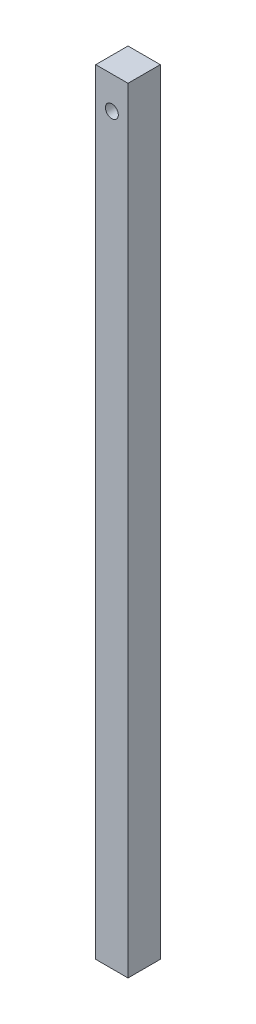
ISO-10303-21;
HEADER;
FILE_DESCRIPTION(('STEP AP214'),'2;1');
FILE_NAME('part.step','',(''),(''),'','','');
FILE_SCHEMA(('AUTOMOTIVE_DESIGN { 1 0 10303 214 1 1 1 1 }'));
ENDSEC;
DATA;
#1=APPLICATION_CONTEXT('core data for automotive mechanical design processes');
#2=APPLICATION_PROTOCOL_DEFINITION('international standard','automotive_design',2000,#1);
#3=PRODUCT_CONTEXT('',#1,'mechanical');
#4=PRODUCT('Part','Part','',(#3));
#5=PRODUCT_RELATED_PRODUCT_CATEGORY('part','',(#4));
#6=PRODUCT_DEFINITION_FORMATION('','',#4);
#7=PRODUCT_DEFINITION_CONTEXT('part definition',#1,'design');
#8=PRODUCT_DEFINITION('design','',#6,#7);
#9=PRODUCT_DEFINITION_SHAPE('','',#8);
#10=(LENGTH_UNIT() NAMED_UNIT(*) SI_UNIT(.MILLI.,.METRE.));
#11=(NAMED_UNIT(*) PLANE_ANGLE_UNIT() SI_UNIT($,.RADIAN.));
#12=(NAMED_UNIT(*) SI_UNIT($,.STERADIAN.) SOLID_ANGLE_UNIT());
#13=UNCERTAINTY_MEASURE_WITH_UNIT(LENGTH_MEASURE(1.E-05),#10,'distance_accuracy_value','');
#14=(GEOMETRIC_REPRESENTATION_CONTEXT(3) GLOBAL_UNCERTAINTY_ASSIGNED_CONTEXT((#13)) GLOBAL_UNIT_ASSIGNED_CONTEXT((#10,
#11,#12)) REPRESENTATION_CONTEXT('',''));
#15=CARTESIAN_POINT('',(0.,0.,0.));
#16=DIRECTION('',(0.,0.,1.));
#17=DIRECTION('',(1.,0.,0.));
#18=AXIS2_PLACEMENT_3D('',#15,#16,#17);
#19=CARTESIAN_POINT('',(-2.5,120.,5.));
#20=DIRECTION('',(1.,0.,0.));
#21=DIRECTION('',(0.,0.,-1.));
#22=AXIS2_PLACEMENT_3D('',#19,#20,#21);
#23=PLANE('',#22);
#24=DIRECTION('',(0.,-1.,0.));
#25=VECTOR('',#24,1.);
#26=CARTESIAN_POINT('',(-2.5,120.,0.));
#27=LINE('',#26,#25);
#28=CARTESIAN_POINT('',(-2.5,120.,0.));
#29=VERTEX_POINT('',#28);
#30=CARTESIAN_POINT('',(-2.5,0.,0.));
#31=VERTEX_POINT('',#30);
#32=EDGE_CURVE('E102',#29,#31,#27,.T.);
#33=ORIENTED_EDGE('',*,*,#32,.T.);
#34=DIRECTION('',(0.,0.,-1.));
#35=VECTOR('',#34,1.);
#36=CARTESIAN_POINT('',(-2.5,0.,5.));
#37=LINE('',#36,#35);
#38=CARTESIAN_POINT('',(-2.5,0.,5.));
#39=VERTEX_POINT('',#38);
#40=EDGE_CURVE('E11',#39,#31,#37,.T.);
#41=ORIENTED_EDGE('',*,*,#40,.F.);
#42=DIRECTION('',(0.,-1.,0.));
#43=VECTOR('',#42,1.);
#44=CARTESIAN_POINT('',(-2.5,120.,5.));
#45=LINE('',#44,#43);
#46=CARTESIAN_POINT('',(-2.5,120.,5.));
#47=VERTEX_POINT('',#46);
#48=EDGE_CURVE('E93',#47,#39,#45,.T.);
#49=ORIENTED_EDGE('',*,*,#48,.F.);
#50=DIRECTION('',(0.,0.,-1.));
#51=VECTOR('',#50,1.);
#52=CARTESIAN_POINT('',(-2.5,120.,5.));
#53=LINE('',#52,#51);
#54=EDGE_CURVE('E99',#47,#29,#53,.T.);
#55=ORIENTED_EDGE('',*,*,#54,.T.);
#56=EDGE_LOOP('',(#33,#41,#49,#55));
#57=FACE_BOUND('',#56,.T.);
#58=ADVANCED_FACE('F39',(#57),#23,.F.);
#59=CARTESIAN_POINT('',(-2.5,0.,5.));
#60=DIRECTION('',(0.,1.,0.));
#61=DIRECTION('',(0.,0.,1.));
#62=AXIS2_PLACEMENT_3D('',#59,#60,#61);
#63=PLANE('',#62);
#64=DIRECTION('',(1.,0.,0.));
#65=VECTOR('',#64,1.);
#66=CARTESIAN_POINT('',(-2.5,0.,0.));
#67=LINE('',#66,#65);
#68=CARTESIAN_POINT('',(2.5,0.,0.));
#69=VERTEX_POINT('',#68);
#70=EDGE_CURVE('E92',#31,#69,#67,.T.);
#71=ORIENTED_EDGE('',*,*,#70,.T.);
#72=DIRECTION('',(0.,0.,-1.));
#73=VECTOR('',#72,1.);
#74=CARTESIAN_POINT('',(2.5,0.,5.));
#75=LINE('',#74,#73);
#76=CARTESIAN_POINT('',(2.5,0.,5.));
#77=VERTEX_POINT('',#76);
#78=EDGE_CURVE('E48',#77,#69,#75,.T.);
#79=ORIENTED_EDGE('',*,*,#78,.F.);
#80=DIRECTION('',(1.,0.,0.));
#81=VECTOR('',#80,1.);
#82=CARTESIAN_POINT('',(-2.5,0.,5.));
#83=LINE('',#82,#81);
#84=EDGE_CURVE('E88',#39,#77,#83,.T.);
#85=ORIENTED_EDGE('',*,*,#84,.F.);
#86=ORIENTED_EDGE('',*,*,#40,.T.);
#87=EDGE_LOOP('',(#71,#79,#85,#86));
#88=FACE_BOUND('',#87,.T.);
#89=ADVANCED_FACE('F94',(#88),#63,.F.);
#90=CARTESIAN_POINT('',(2.5,0.,5.));
#91=DIRECTION('',(-1.,0.,0.));
#92=DIRECTION('',(0.,0.,1.));
#93=AXIS2_PLACEMENT_3D('',#90,#91,#92);
#94=PLANE('',#93);
#95=DIRECTION('',(0.,1.,0.));
#96=VECTOR('',#95,1.);
#97=CARTESIAN_POINT('',(2.5,0.,0.));
#98=LINE('',#97,#96);
#99=CARTESIAN_POINT('',(2.5,120.,0.));
#100=VERTEX_POINT('',#99);
#101=EDGE_CURVE('E71',#69,#100,#98,.T.);
#102=ORIENTED_EDGE('',*,*,#101,.T.);
#103=DIRECTION('',(0.,0.,-1.));
#104=VECTOR('',#103,1.);
#105=CARTESIAN_POINT('',(2.5,120.,5.));
#106=LINE('',#105,#104);
#107=CARTESIAN_POINT('',(2.5,120.,5.));
#108=VERTEX_POINT('',#107);
#109=EDGE_CURVE('E96',#108,#100,#106,.T.);
#110=ORIENTED_EDGE('',*,*,#109,.F.);
#111=DIRECTION('',(0.,1.,0.));
#112=VECTOR('',#111,1.);
#113=CARTESIAN_POINT('',(2.5,0.,5.));
#114=LINE('',#113,#112);
#115=EDGE_CURVE('E90',#77,#108,#114,.T.);
#116=ORIENTED_EDGE('',*,*,#115,.F.);
#117=ORIENTED_EDGE('',*,*,#78,.T.);
#118=EDGE_LOOP('',(#102,#110,#116,#117));
#119=FACE_BOUND('',#118,.T.);
#120=ADVANCED_FACE('F98',(#119),#94,.F.);
#121=CARTESIAN_POINT('',(2.5,120.,5.));
#122=DIRECTION('',(0.,-1.,0.));
#123=DIRECTION('',(0.,0.,-1.));
#124=AXIS2_PLACEMENT_3D('',#121,#122,#123);
#125=PLANE('',#124);
#126=DIRECTION('',(-1.,0.,0.));
#127=VECTOR('',#126,1.);
#128=CARTESIAN_POINT('',(2.5,120.,0.));
#129=LINE('',#128,#127);
#130=EDGE_CURVE('E78',#100,#29,#129,.T.);
#131=ORIENTED_EDGE('',*,*,#130,.T.);
#132=ORIENTED_EDGE('',*,*,#54,.F.);
#133=DIRECTION('',(-1.,0.,0.));
#134=VECTOR('',#133,1.);
#135=CARTESIAN_POINT('',(2.5,120.,5.));
#136=LINE('',#135,#134);
#137=EDGE_CURVE('E57',#108,#47,#136,.T.);
#138=ORIENTED_EDGE('',*,*,#137,.F.);
#139=ORIENTED_EDGE('',*,*,#109,.T.);
#140=EDGE_LOOP('',(#131,#132,#138,#139));
#141=FACE_BOUND('',#140,.T.);
#142=ADVANCED_FACE('F115',(#141),#125,.F.);
#143=CARTESIAN_POINT('',(0.,0.,5.));
#144=DIRECTION('',(0.,0.,1.));
#145=DIRECTION('',(1.,0.,0.));
#146=AXIS2_PLACEMENT_3D('',#143,#144,#145);
#147=PLANE('',#146);
#148=CARTESIAN_POINT('',(0.,115.,5.));
#149=DIRECTION('',(0.,0.,1.));
#150=DIRECTION('',(1.,0.,0.));
#151=AXIS2_PLACEMENT_3D('',#148,#149,#150);
#152=CIRCLE('',#151,1.);
#153=CARTESIAN_POINT('',(1.,115.,5.));
#154=VERTEX_POINT('',#153);
#155=EDGE_CURVE('E110',#154,#154,#152,.T.);
#156=ORIENTED_EDGE('',*,*,#155,.F.);
#157=EDGE_LOOP('',(#156));
#158=FACE_BOUND('',#157,.T.);
#159=ORIENTED_EDGE('',*,*,#48,.T.);
#160=ORIENTED_EDGE('',*,*,#84,.T.);
#161=ORIENTED_EDGE('',*,*,#115,.T.);
#162=ORIENTED_EDGE('',*,*,#137,.T.);
#163=EDGE_LOOP('',(#159,#160,#161,#162));
#164=FACE_BOUND('',#163,.T.);
#165=ADVANCED_FACE('F87',(#158,#164),#147,.T.);
#166=CARTESIAN_POINT('',(0.,0.,0.));
#167=DIRECTION('',(0.,0.,1.));
#168=DIRECTION('',(1.,0.,0.));
#169=AXIS2_PLACEMENT_3D('',#166,#167,#168);
#170=PLANE('',#169);
#171=CARTESIAN_POINT('',(0.,115.,0.));
#172=DIRECTION('',(0.,0.,1.));
#173=DIRECTION('',(1.,0.,0.));
#174=AXIS2_PLACEMENT_3D('',#171,#172,#173);
#175=CIRCLE('',#174,1.);
#176=CARTESIAN_POINT('',(1.,115.,0.));
#177=VERTEX_POINT('',#176);
#178=EDGE_CURVE('E45',#177,#177,#175,.T.);
#179=ORIENTED_EDGE('',*,*,#178,.T.);
#180=EDGE_LOOP('',(#179));
#181=FACE_BOUND('',#180,.T.);
#182=ORIENTED_EDGE('',*,*,#32,.F.);
#183=ORIENTED_EDGE('',*,*,#130,.F.);
#184=ORIENTED_EDGE('',*,*,#101,.F.);
#185=ORIENTED_EDGE('',*,*,#70,.F.);
#186=EDGE_LOOP('',(#182,#183,#184,#185));
#187=FACE_BOUND('',#186,.T.);
#188=ADVANCED_FACE('F113',(#181,#187),#170,.F.);
#189=CARTESIAN_POINT('',(0.,115.,-10.));
#190=DIRECTION('',(0.,0.,1.));
#191=DIRECTION('',(1.,0.,0.));
#192=AXIS2_PLACEMENT_3D('',#189,#190,#191);
#193=CYLINDRICAL_SURFACE('',#192,1.);
#194=ORIENTED_EDGE('',*,*,#155,.T.);
#195=EDGE_LOOP('',(#194));
#196=FACE_BOUND('',#195,.T.);
#197=ORIENTED_EDGE('',*,*,#178,.F.);
#198=EDGE_LOOP('',(#197));
#199=FACE_BOUND('',#198,.T.);
#200=ADVANCED_FACE('F124',(#196,#199),#193,.F.);
#201=CLOSED_SHELL('',(#58,#89,#120,#142,#165,#188,#200));
#202=MANIFOLD_SOLID_BREP('B2',#201);
#203=ADVANCED_BREP_SHAPE_REPRESENTATION('',(#18,#202),#14);
#204=SHAPE_DEFINITION_REPRESENTATION(#9,#203);
ENDSEC;
END-ISO-10303-21;
